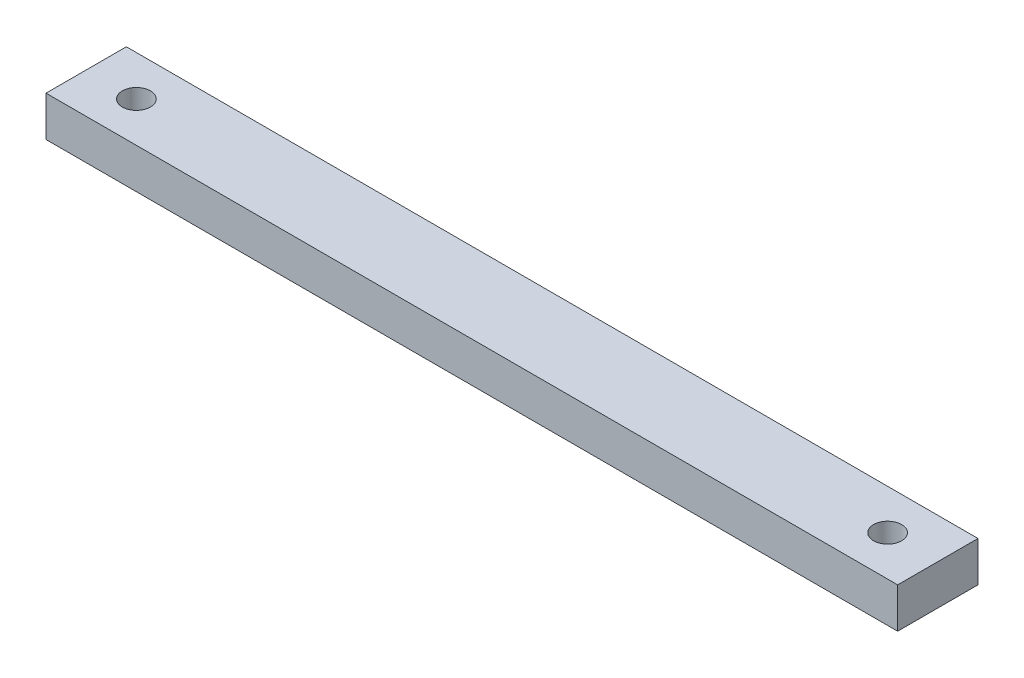
ISO-10303-21;
HEADER;
FILE_DESCRIPTION(('STEP AP214'),'2;1');
FILE_NAME('part.step','',(''),(''),'','','');
FILE_SCHEMA(('AUTOMOTIVE_DESIGN { 1 0 10303 214 1 1 1 1 }'));
ENDSEC;
DATA;
#1=APPLICATION_CONTEXT('core data for automotive mechanical design processes');
#2=APPLICATION_PROTOCOL_DEFINITION('international standard','automotive_design',2000,#1);
#3=PRODUCT_CONTEXT('',#1,'mechanical');
#4=PRODUCT('Part','Part','',(#3));
#5=PRODUCT_RELATED_PRODUCT_CATEGORY('part','',(#4));
#6=PRODUCT_DEFINITION_FORMATION('','',#4);
#7=PRODUCT_DEFINITION_CONTEXT('part definition',#1,'design');
#8=PRODUCT_DEFINITION('design','',#6,#7);
#9=PRODUCT_DEFINITION_SHAPE('','',#8);
#10=(LENGTH_UNIT() NAMED_UNIT(*) SI_UNIT(.MILLI.,.METRE.));
#11=(NAMED_UNIT(*) PLANE_ANGLE_UNIT() SI_UNIT($,.RADIAN.));
#12=(NAMED_UNIT(*) SI_UNIT($,.STERADIAN.) SOLID_ANGLE_UNIT());
#13=UNCERTAINTY_MEASURE_WITH_UNIT(LENGTH_MEASURE(1.E-05),#10,'distance_accuracy_value','');
#14=(GEOMETRIC_REPRESENTATION_CONTEXT(3) GLOBAL_UNCERTAINTY_ASSIGNED_CONTEXT((#13)) GLOBAL_UNIT_ASSIGNED_CONTEXT((#10,
#11,#12)) REPRESENTATION_CONTEXT('',''));
#15=CARTESIAN_POINT('',(0.,0.,0.));
#16=DIRECTION('',(0.,0.,1.));
#17=DIRECTION('',(1.,0.,0.));
#18=AXIS2_PLACEMENT_3D('',#15,#16,#17);
#19=CARTESIAN_POINT('',(0.,1.,0.));
#20=DIRECTION('',(0.,1.,0.));
#21=DIRECTION('',(0.,0.,1.));
#22=AXIS2_PLACEMENT_3D('',#19,#20,#21);
#23=PLANE('',#22);
#24=CARTESIAN_POINT('',(-9.35,1.,0.));
#25=DIRECTION('',(0.,1.,0.));
#26=DIRECTION('',(0.,0.,1.));
#27=AXIS2_PLACEMENT_3D('',#24,#25,#26);
#28=CIRCLE('',#27,0.349999999999999);
#29=CARTESIAN_POINT('',(-9.35,1.,0.349999999999999));
#30=VERTEX_POINT('',#29);
#31=EDGE_CURVE('E100',#30,#30,#28,.T.);
#32=ORIENTED_EDGE('',*,*,#31,.F.);
#33=EDGE_LOOP('',(#32));
#34=FACE_BOUND('',#33,.T.);
#35=DIRECTION('',(0.,0.,-1.));
#36=VECTOR('',#35,1.);
#37=CARTESIAN_POINT('',(10.6,1.,-1.));
#38=LINE('',#37,#36);
#39=CARTESIAN_POINT('',(10.6,1.,1.));
#40=VERTEX_POINT('',#39);
#41=CARTESIAN_POINT('',(10.6,1.,-1.));
#42=VERTEX_POINT('',#41);
#43=EDGE_CURVE('E85',#40,#42,#38,.T.);
#44=ORIENTED_EDGE('',*,*,#43,.T.);
#45=DIRECTION('',(-1.,0.,0.));
#46=VECTOR('',#45,1.);
#47=CARTESIAN_POINT('',(-10.6,1.,-1.));
#48=LINE('',#47,#46);
#49=CARTESIAN_POINT('',(-10.6,1.,-1.));
#50=VERTEX_POINT('',#49);
#51=EDGE_CURVE('E80',#42,#50,#48,.T.);
#52=ORIENTED_EDGE('',*,*,#51,.T.);
#53=DIRECTION('',(0.,0.,1.));
#54=VECTOR('',#53,1.);
#55=CARTESIAN_POINT('',(-10.6,1.,-1.));
#56=LINE('',#55,#54);
#57=CARTESIAN_POINT('',(-10.6,1.,1.));
#58=VERTEX_POINT('',#57);
#59=EDGE_CURVE('E83',#50,#58,#56,.T.);
#60=ORIENTED_EDGE('',*,*,#59,.T.);
#61=DIRECTION('',(1.,0.,0.));
#62=VECTOR('',#61,1.);
#63=CARTESIAN_POINT('',(-10.6,1.,1.));
#64=LINE('',#63,#62);
#65=EDGE_CURVE('E50',#58,#40,#64,.T.);
#66=ORIENTED_EDGE('',*,*,#65,.T.);
#67=EDGE_LOOP('',(#44,#52,#60,#66));
#68=FACE_BOUND('',#67,.T.);
#69=CARTESIAN_POINT('',(9.35,1.,0.));
#70=DIRECTION('',(0.,1.,0.));
#71=DIRECTION('',(0.,0.,-1.));
#72=AXIS2_PLACEMENT_3D('',#69,#70,#71);
#73=CIRCLE('',#72,0.349999999999999);
#74=CARTESIAN_POINT('',(9.35,1.,-0.349999999999999));
#75=VERTEX_POINT('',#74);
#76=EDGE_CURVE('E115',#75,#75,#73,.T.);
#77=ORIENTED_EDGE('',*,*,#76,.F.);
#78=EDGE_LOOP('',(#77));
#79=FACE_BOUND('',#78,.T.);
#80=ADVANCED_FACE('F33',(#34,#68,#79),#23,.T.);
#81=CARTESIAN_POINT('',(0.,0.,0.));
#82=DIRECTION('',(0.,1.,0.));
#83=DIRECTION('',(0.,0.,1.));
#84=AXIS2_PLACEMENT_3D('',#81,#82,#83);
#85=PLANE('',#84);
#86=CARTESIAN_POINT('',(-9.35,0.,0.));
#87=DIRECTION('',(0.,1.,0.));
#88=DIRECTION('',(0.,0.,1.));
#89=AXIS2_PLACEMENT_3D('',#86,#87,#88);
#90=CIRCLE('',#89,0.349999999999999);
#91=CARTESIAN_POINT('',(-9.35,0.,0.349999999999999));
#92=VERTEX_POINT('',#91);
#93=EDGE_CURVE('E112',#92,#92,#90,.T.);
#94=ORIENTED_EDGE('',*,*,#93,.T.);
#95=EDGE_LOOP('',(#94));
#96=FACE_BOUND('',#95,.T.);
#97=DIRECTION('',(0.,0.,-1.));
#98=VECTOR('',#97,1.);
#99=CARTESIAN_POINT('',(10.6,0.,-1.));
#100=LINE('',#99,#98);
#101=CARTESIAN_POINT('',(10.6,0.,1.));
#102=VERTEX_POINT('',#101);
#103=CARTESIAN_POINT('',(10.6,0.,-1.));
#104=VERTEX_POINT('',#103);
#105=EDGE_CURVE('E97',#102,#104,#100,.T.);
#106=ORIENTED_EDGE('',*,*,#105,.F.);
#107=DIRECTION('',(1.,0.,0.));
#108=VECTOR('',#107,1.);
#109=CARTESIAN_POINT('',(-10.6,0.,1.));
#110=LINE('',#109,#108);
#111=CARTESIAN_POINT('',(-10.6,0.,1.));
#112=VERTEX_POINT('',#111);
#113=EDGE_CURVE('E73',#112,#102,#110,.T.);
#114=ORIENTED_EDGE('',*,*,#113,.F.);
#115=DIRECTION('',(0.,0.,1.));
#116=VECTOR('',#115,1.);
#117=CARTESIAN_POINT('',(-10.6,0.,-1.));
#118=LINE('',#117,#116);
#119=CARTESIAN_POINT('',(-10.6,0.,-1.));
#120=VERTEX_POINT('',#119);
#121=EDGE_CURVE('E67',#120,#112,#118,.T.);
#122=ORIENTED_EDGE('',*,*,#121,.F.);
#123=DIRECTION('',(-1.,0.,0.));
#124=VECTOR('',#123,1.);
#125=CARTESIAN_POINT('',(-10.6,0.,-1.));
#126=LINE('',#125,#124);
#127=EDGE_CURVE('E89',#104,#120,#126,.T.);
#128=ORIENTED_EDGE('',*,*,#127,.F.);
#129=EDGE_LOOP('',(#106,#114,#122,#128));
#130=FACE_BOUND('',#129,.T.);
#131=CARTESIAN_POINT('',(9.35,0.,0.));
#132=DIRECTION('',(0.,1.,0.));
#133=DIRECTION('',(0.,0.,-1.));
#134=AXIS2_PLACEMENT_3D('',#131,#132,#133);
#135=CIRCLE('',#134,0.349999999999999);
#136=CARTESIAN_POINT('',(9.35,0.,-0.349999999999999));
#137=VERTEX_POINT('',#136);
#138=EDGE_CURVE('E118',#137,#137,#135,.T.);
#139=ORIENTED_EDGE('',*,*,#138,.T.);
#140=EDGE_LOOP('',(#139));
#141=FACE_BOUND('',#140,.T.);
#142=ADVANCED_FACE('F108',(#96,#130,#141),#85,.F.);
#143=CARTESIAN_POINT('',(10.6,1.,-1.));
#144=DIRECTION('',(-1.,0.,0.));
#145=DIRECTION('',(0.,0.,1.));
#146=AXIS2_PLACEMENT_3D('',#143,#144,#145);
#147=PLANE('',#146);
#148=ORIENTED_EDGE('',*,*,#105,.T.);
#149=DIRECTION('',(0.,-1.,0.));
#150=VECTOR('',#149,1.);
#151=CARTESIAN_POINT('',(10.6,1.,-1.));
#152=LINE('',#151,#150);
#153=EDGE_CURVE('E11',#42,#104,#152,.T.);
#154=ORIENTED_EDGE('',*,*,#153,.F.);
#155=ORIENTED_EDGE('',*,*,#43,.F.);
#156=DIRECTION('',(0.,-1.,0.));
#157=VECTOR('',#156,1.);
#158=CARTESIAN_POINT('',(10.6,1.,1.));
#159=LINE('',#158,#157);
#160=EDGE_CURVE('E93',#40,#102,#159,.T.);
#161=ORIENTED_EDGE('',*,*,#160,.T.);
#162=EDGE_LOOP('',(#148,#154,#155,#161));
#163=FACE_BOUND('',#162,.T.);
#164=ADVANCED_FACE('F35',(#163),#147,.F.);
#165=CARTESIAN_POINT('',(-10.6,1.,-1.));
#166=DIRECTION('',(0.,0.,1.));
#167=DIRECTION('',(1.,0.,0.));
#168=AXIS2_PLACEMENT_3D('',#165,#166,#167);
#169=PLANE('',#168);
#170=ORIENTED_EDGE('',*,*,#127,.T.);
#171=DIRECTION('',(0.,-1.,0.));
#172=VECTOR('',#171,1.);
#173=CARTESIAN_POINT('',(-10.6,1.,-1.));
#174=LINE('',#173,#172);
#175=EDGE_CURVE('E42',#50,#120,#174,.T.);
#176=ORIENTED_EDGE('',*,*,#175,.F.);
#177=ORIENTED_EDGE('',*,*,#51,.F.);
#178=ORIENTED_EDGE('',*,*,#153,.T.);
#179=EDGE_LOOP('',(#170,#176,#177,#178));
#180=FACE_BOUND('',#179,.T.);
#181=ADVANCED_FACE('F88',(#180),#169,.F.);
#182=CARTESIAN_POINT('',(-10.6,1.,-1.));
#183=DIRECTION('',(1.,0.,0.));
#184=DIRECTION('',(0.,0.,-1.));
#185=AXIS2_PLACEMENT_3D('',#182,#183,#184);
#186=PLANE('',#185);
#187=ORIENTED_EDGE('',*,*,#121,.T.);
#188=DIRECTION('',(0.,-1.,0.));
#189=VECTOR('',#188,1.);
#190=CARTESIAN_POINT('',(-10.6,1.,1.));
#191=LINE('',#190,#189);
#192=EDGE_CURVE('E90',#58,#112,#191,.T.);
#193=ORIENTED_EDGE('',*,*,#192,.F.);
#194=ORIENTED_EDGE('',*,*,#59,.F.);
#195=ORIENTED_EDGE('',*,*,#175,.T.);
#196=EDGE_LOOP('',(#187,#193,#194,#195));
#197=FACE_BOUND('',#196,.T.);
#198=ADVANCED_FACE('F91',(#197),#186,.F.);
#199=CARTESIAN_POINT('',(-10.6,1.,1.));
#200=DIRECTION('',(0.,0.,-1.));
#201=DIRECTION('',(-1.,0.,0.));
#202=AXIS2_PLACEMENT_3D('',#199,#200,#201);
#203=PLANE('',#202);
#204=ORIENTED_EDGE('',*,*,#113,.T.);
#205=ORIENTED_EDGE('',*,*,#160,.F.);
#206=ORIENTED_EDGE('',*,*,#65,.F.);
#207=ORIENTED_EDGE('',*,*,#192,.T.);
#208=EDGE_LOOP('',(#204,#205,#206,#207));
#209=FACE_BOUND('',#208,.T.);
#210=ADVANCED_FACE('F105',(#209),#203,.F.);
#211=CARTESIAN_POINT('',(-9.35,1.,0.));
#212=DIRECTION('',(0.,-1.,0.));
#213=DIRECTION('',(0.,0.,-1.));
#214=AXIS2_PLACEMENT_3D('',#211,#212,#213);
#215=CYLINDRICAL_SURFACE('',#214,0.349999999999999);
#216=ORIENTED_EDGE('',*,*,#31,.T.);
#217=EDGE_LOOP('',(#216));
#218=FACE_BOUND('',#217,.T.);
#219=ORIENTED_EDGE('',*,*,#93,.F.);
#220=EDGE_LOOP('',(#219));
#221=FACE_BOUND('',#220,.T.);
#222=ADVANCED_FACE('F136',(#218,#221),#215,.F.);
#223=CARTESIAN_POINT('',(9.35,1.,0.));
#224=DIRECTION('',(0.,-1.,0.));
#225=DIRECTION('',(0.,0.,-1.));
#226=AXIS2_PLACEMENT_3D('',#223,#224,#225);
#227=CYLINDRICAL_SURFACE('',#226,0.349999999999999);
#228=ORIENTED_EDGE('',*,*,#76,.T.);
#229=EDGE_LOOP('',(#228));
#230=FACE_BOUND('',#229,.T.);
#231=ORIENTED_EDGE('',*,*,#138,.F.);
#232=EDGE_LOOP('',(#231));
#233=FACE_BOUND('',#232,.T.);
#234=ADVANCED_FACE('F124',(#230,#233),#227,.F.);
#235=CLOSED_SHELL('',(#80,#142,#164,#181,#198,#210,#222,#234));
#236=MANIFOLD_SOLID_BREP('B2',#235);
#237=ADVANCED_BREP_SHAPE_REPRESENTATION('',(#18,#236),#14);
#238=SHAPE_DEFINITION_REPRESENTATION(#9,#237);
ENDSEC;
END-ISO-10303-21;
